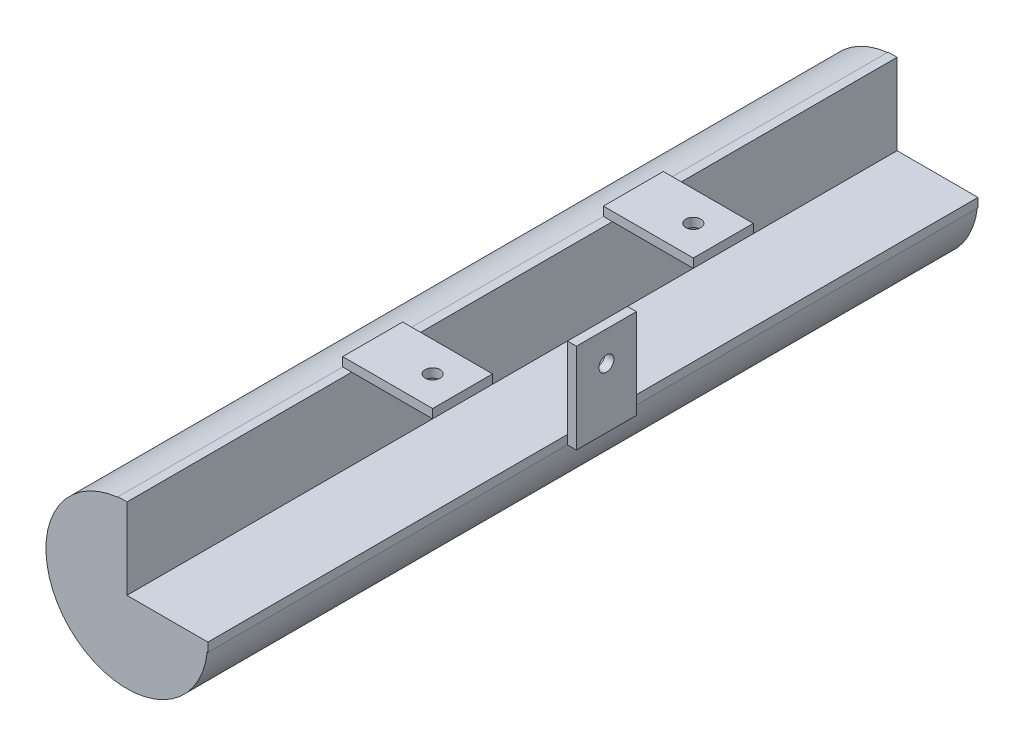
ISO-10303-21;
HEADER;
FILE_DESCRIPTION(('STEP AP214'),'2;1');
FILE_NAME('part.step','',(''),(''),'','','');
FILE_SCHEMA(('AUTOMOTIVE_DESIGN { 1 0 10303 214 1 1 1 1 }'));
ENDSEC;
DATA;
#1=APPLICATION_CONTEXT('core data for automotive mechanical design processes');
#2=APPLICATION_PROTOCOL_DEFINITION('international standard','automotive_design',2000,#1);
#3=PRODUCT_CONTEXT('',#1,'mechanical');
#4=PRODUCT('Part','Part','',(#3));
#5=PRODUCT_RELATED_PRODUCT_CATEGORY('part','',(#4));
#6=PRODUCT_DEFINITION_FORMATION('','',#4);
#7=PRODUCT_DEFINITION_CONTEXT('part definition',#1,'design');
#8=PRODUCT_DEFINITION('design','',#6,#7);
#9=PRODUCT_DEFINITION_SHAPE('','',#8);
#10=(LENGTH_UNIT() NAMED_UNIT(*) SI_UNIT(.MILLI.,.METRE.));
#11=(NAMED_UNIT(*) PLANE_ANGLE_UNIT() SI_UNIT($,.RADIAN.));
#12=(NAMED_UNIT(*) SI_UNIT($,.STERADIAN.) SOLID_ANGLE_UNIT());
#13=UNCERTAINTY_MEASURE_WITH_UNIT(LENGTH_MEASURE(1.E-05),#10,'distance_accuracy_value','');
#14=(GEOMETRIC_REPRESENTATION_CONTEXT(3) GLOBAL_UNCERTAINTY_ASSIGNED_CONTEXT((#13)) GLOBAL_UNIT_ASSIGNED_CONTEXT((#10,
#11,#12)) REPRESENTATION_CONTEXT('',''));
#15=CARTESIAN_POINT('',(0.,0.,0.));
#16=DIRECTION('',(0.,0.,1.));
#17=DIRECTION('',(1.,0.,0.));
#18=AXIS2_PLACEMENT_3D('',#15,#16,#17);
#19=CARTESIAN_POINT('',(27.,0.,128.5));
#20=DIRECTION('',(-1.,0.,0.));
#21=DIRECTION('',(0.,0.,1.));
#22=AXIS2_PLACEMENT_3D('',#19,#20,#21);
#23=PLANE('',#22);
#24=DIRECTION('',(0.,1.,0.));
#25=VECTOR('',#24,1.);
#26=CARTESIAN_POINT('',(27.,-3.,-11.5));
#27=LINE('',#26,#25);
#28=CARTESIAN_POINT('',(27.,-3.,-11.5));
#29=VERTEX_POINT('',#28);
#30=CARTESIAN_POINT('',(27.,0.,-11.5));
#31=VERTEX_POINT('',#30);
#32=EDGE_CURVE('E64',#29,#31,#27,.T.);
#33=ORIENTED_EDGE('',*,*,#32,.F.);
#34=DIRECTION('',(0.,0.,-1.));
#35=VECTOR('',#34,1.);
#36=CARTESIAN_POINT('',(27.,-3.,128.5));
#37=LINE('',#36,#35);
#38=CARTESIAN_POINT('',(27.,-3.,-128.5));
#39=VERTEX_POINT('',#38);
#40=EDGE_CURVE('E385',#29,#39,#37,.T.);
#41=ORIENTED_EDGE('',*,*,#40,.T.);
#42=DIRECTION('',(0.,1.,0.));
#43=VECTOR('',#42,1.);
#44=CARTESIAN_POINT('',(27.,0.,-128.5));
#45=LINE('',#44,#43);
#46=CARTESIAN_POINT('',(27.,0.,-128.5));
#47=VERTEX_POINT('',#46);
#48=EDGE_CURVE('E373',#39,#47,#45,.T.);
#49=ORIENTED_EDGE('',*,*,#48,.T.);
#50=DIRECTION('',(0.,0.,-1.));
#51=VECTOR('',#50,1.);
#52=CARTESIAN_POINT('',(27.,0.,128.5));
#53=LINE('',#52,#51);
#54=EDGE_CURVE('E69',#31,#47,#53,.T.);
#55=ORIENTED_EDGE('',*,*,#54,.F.);
#56=EDGE_LOOP('',(#33,#41,#49,#55));
#57=FACE_BOUND('',#56,.T.);
#58=ADVANCED_FACE('F45',(#57),#23,.F.);
#59=DIRECTION('',(0.,-1.,0.));
#60=VECTOR('',#59,1.);
#61=CARTESIAN_POINT('',(27.,-3.,8.50000000000001));
#62=LINE('',#61,#60);
#63=CARTESIAN_POINT('',(27.,0.,8.50000000000001));
#64=VERTEX_POINT('',#63);
#65=CARTESIAN_POINT('',(27.,-3.,8.50000000000001));
#66=VERTEX_POINT('',#65);
#67=EDGE_CURVE('E11',#64,#66,#62,.T.);
#68=ORIENTED_EDGE('',*,*,#67,.F.);
#69=CARTESIAN_POINT('',(27.,0.,128.5));
#70=VERTEX_POINT('',#69);
#71=EDGE_CURVE('E381',#70,#64,#53,.T.);
#72=ORIENTED_EDGE('',*,*,#71,.F.);
#73=DIRECTION('',(0.,1.,0.));
#74=VECTOR('',#73,1.);
#75=CARTESIAN_POINT('',(27.,0.,128.5));
#76=LINE('',#75,#74);
#77=CARTESIAN_POINT('',(27.,-3.,128.5));
#78=VERTEX_POINT('',#77);
#79=EDGE_CURVE('E349',#78,#70,#76,.T.);
#80=ORIENTED_EDGE('',*,*,#79,.F.);
#81=EDGE_CURVE('E387',#78,#66,#37,.T.);
#82=ORIENTED_EDGE('',*,*,#81,.T.);
#83=EDGE_LOOP('',(#68,#72,#80,#82));
#84=FACE_BOUND('',#83,.T.);
#85=ADVANCED_FACE('F529',(#84),#23,.F.);
#86=CARTESIAN_POINT('',(0.,27.,128.5));
#87=DIRECTION('',(0.,-1.,0.));
#88=DIRECTION('',(0.,0.,-1.));
#89=AXIS2_PLACEMENT_3D('',#86,#87,#88);
#90=PLANE('',#89);
#91=DIRECTION('',(1.,0.,0.));
#92=VECTOR('',#91,1.);
#93=CARTESIAN_POINT('',(-3.,27.,-33.5));
#94=LINE('',#93,#92);
#95=CARTESIAN_POINT('',(-3.,27.,-33.5));
#96=VERTEX_POINT('',#95);
#97=CARTESIAN_POINT('',(0.,27.,-33.5));
#98=VERTEX_POINT('',#97);
#99=EDGE_CURVE('E270',#96,#98,#94,.T.);
#100=ORIENTED_EDGE('',*,*,#99,.F.);
#101=DIRECTION('',(0.,0.,-1.));
#102=VECTOR('',#101,1.);
#103=CARTESIAN_POINT('',(-3.,27.,128.5));
#104=LINE('',#103,#102);
#105=CARTESIAN_POINT('',(-3.,27.,33.5));
#106=VERTEX_POINT('',#105);
#107=EDGE_CURVE('E402',#106,#96,#104,.T.);
#108=ORIENTED_EDGE('',*,*,#107,.F.);
#109=DIRECTION('',(-1.,0.,0.));
#110=VECTOR('',#109,1.);
#111=CARTESIAN_POINT('',(-3.,27.,33.5));
#112=LINE('',#111,#110);
#113=CARTESIAN_POINT('',(0.,27.,33.5));
#114=VERTEX_POINT('',#113);
#115=EDGE_CURVE('E55',#114,#106,#112,.T.);
#116=ORIENTED_EDGE('',*,*,#115,.F.);
#117=DIRECTION('',(0.,0.,-1.));
#118=VECTOR('',#117,1.);
#119=CARTESIAN_POINT('',(0.,27.,128.5));
#120=LINE('',#119,#118);
#121=EDGE_CURVE('E409',#114,#98,#120,.T.);
#122=ORIENTED_EDGE('',*,*,#121,.T.);
#123=EDGE_LOOP('',(#100,#108,#116,#122));
#124=FACE_BOUND('',#123,.T.);
#125=ADVANCED_FACE('F474',(#124),#90,.F.);
#126=DIRECTION('',(-1.,0.,0.));
#127=VECTOR('',#126,1.);
#128=CARTESIAN_POINT('',(-3.,27.,-53.5));
#129=LINE('',#128,#127);
#130=CARTESIAN_POINT('',(0.,27.,-53.5));
#131=VERTEX_POINT('',#130);
#132=CARTESIAN_POINT('',(-3.,27.,-53.5));
#133=VERTEX_POINT('',#132);
#134=EDGE_CURVE('E266',#131,#133,#129,.T.);
#135=ORIENTED_EDGE('',*,*,#134,.F.);
#136=CARTESIAN_POINT('',(0.,27.,-128.5));
#137=VERTEX_POINT('',#136);
#138=EDGE_CURVE('E401',#131,#137,#120,.T.);
#139=ORIENTED_EDGE('',*,*,#138,.T.);
#140=DIRECTION('',(-1.,0.,0.));
#141=VECTOR('',#140,1.);
#142=CARTESIAN_POINT('',(0.,27.,-128.5));
#143=LINE('',#142,#141);
#144=CARTESIAN_POINT('',(-3.,27.,-128.5));
#145=VERTEX_POINT('',#144);
#146=EDGE_CURVE('E359',#137,#145,#143,.T.);
#147=ORIENTED_EDGE('',*,*,#146,.T.);
#148=EDGE_CURVE('E397',#133,#145,#104,.T.);
#149=ORIENTED_EDGE('',*,*,#148,.F.);
#150=EDGE_LOOP('',(#135,#139,#147,#149));
#151=FACE_BOUND('',#150,.T.);
#152=ADVANCED_FACE('F422',(#151),#90,.F.);
#153=DIRECTION('',(1.,0.,0.));
#154=VECTOR('',#153,1.);
#155=CARTESIAN_POINT('',(-3.,27.,53.5));
#156=LINE('',#155,#154);
#157=CARTESIAN_POINT('',(-3.,27.,53.5));
#158=VERTEX_POINT('',#157);
#159=CARTESIAN_POINT('',(0.,27.,53.5));
#160=VERTEX_POINT('',#159);
#161=EDGE_CURVE('E306',#158,#160,#156,.T.);
#162=ORIENTED_EDGE('',*,*,#161,.F.);
#163=CARTESIAN_POINT('',(-3.,27.,128.5));
#164=VERTEX_POINT('',#163);
#165=EDGE_CURVE('E398',#164,#158,#104,.T.);
#166=ORIENTED_EDGE('',*,*,#165,.F.);
#167=DIRECTION('',(-1.,0.,0.));
#168=VECTOR('',#167,1.);
#169=CARTESIAN_POINT('',(0.,27.,128.5));
#170=LINE('',#169,#168);
#171=CARTESIAN_POINT('',(0.,27.,128.5));
#172=VERTEX_POINT('',#171);
#173=EDGE_CURVE('E336',#172,#164,#170,.T.);
#174=ORIENTED_EDGE('',*,*,#173,.F.);
#175=EDGE_CURVE('E49',#172,#160,#120,.T.);
#176=ORIENTED_EDGE('',*,*,#175,.T.);
#177=EDGE_LOOP('',(#162,#166,#174,#176));
#178=FACE_BOUND('',#177,.T.);
#179=ADVANCED_FACE('F446',(#178),#90,.F.);
#180=CARTESIAN_POINT('',(0.,27.,128.5));
#181=DIRECTION('',(-1.,0.,0.));
#182=DIRECTION('',(0.,-1.,0.));
#183=AXIS2_PLACEMENT_3D('',#180,#181,#182);
#184=PLANE('',#183);
#185=DIRECTION('',(0.,1.,0.));
#186=VECTOR('',#185,1.);
#187=CARTESIAN_POINT('',(0.,27.,-128.5));
#188=LINE('',#187,#186);
#189=CARTESIAN_POINT('',(0.,0.,-128.5));
#190=VERTEX_POINT('',#189);
#191=EDGE_CURVE('E331',#190,#137,#188,.T.);
#192=ORIENTED_EDGE('',*,*,#191,.T.);
#193=ORIENTED_EDGE('',*,*,#138,.F.);
#194=DIRECTION('',(0.,0.,1.));
#195=VECTOR('',#194,1.);
#196=CARTESIAN_POINT('',(0.,27.,128.5));
#197=LINE('',#196,#195);
#198=EDGE_CURVE('E274',#131,#98,#197,.T.);
#199=ORIENTED_EDGE('',*,*,#198,.T.);
#200=ORIENTED_EDGE('',*,*,#121,.F.);
#201=EDGE_CURVE('E468',#160,#114,#120,.T.);
#202=ORIENTED_EDGE('',*,*,#201,.F.);
#203=ORIENTED_EDGE('',*,*,#175,.F.);
#204=DIRECTION('',(0.,1.,0.));
#205=VECTOR('',#204,1.);
#206=CARTESIAN_POINT('',(0.,27.,128.5));
#207=LINE('',#206,#205);
#208=CARTESIAN_POINT('',(0.,0.,128.5));
#209=VERTEX_POINT('',#208);
#210=EDGE_CURVE('E332',#209,#172,#207,.T.);
#211=ORIENTED_EDGE('',*,*,#210,.F.);
#212=DIRECTION('',(0.,0.,-1.));
#213=VECTOR('',#212,1.);
#214=CARTESIAN_POINT('',(0.,0.,128.5));
#215=LINE('',#214,#213);
#216=EDGE_CURVE('E355',#209,#190,#215,.T.);
#217=ORIENTED_EDGE('',*,*,#216,.T.);
#218=EDGE_LOOP('',(#192,#193,#199,#200,#202,#203,#211,#217));
#219=FACE_BOUND('',#218,.T.);
#220=ADVANCED_FACE('F47',(#219),#184,.F.);
#221=CARTESIAN_POINT('',(-3.,27.,128.5));
#222=DIRECTION('',(1.,0.,0.));
#223=DIRECTION('',(0.,0.,-1.));
#224=AXIS2_PLACEMENT_3D('',#221,#222,#223);
#225=PLANE('',#224);
#226=DIRECTION('',(0.,-1.,0.));
#227=VECTOR('',#226,1.);
#228=CARTESIAN_POINT('',(-3.,27.,-128.5));
#229=LINE('',#228,#227);
#230=CARTESIAN_POINT('',(-3.,26.8328157299975,-128.5));
#231=VERTEX_POINT('',#230);
#232=EDGE_CURVE('E363',#145,#231,#229,.T.);
#233=ORIENTED_EDGE('',*,*,#232,.T.);
#234=DIRECTION('',(0.,0.,-1.));
#235=VECTOR('',#234,1.);
#236=CARTESIAN_POINT('',(-3.,26.8328157299975,128.5));
#237=LINE('',#236,#235);
#238=CARTESIAN_POINT('',(-3.,26.8328157299975,128.5));
#239=VERTEX_POINT('',#238);
#240=EDGE_CURVE('E394',#239,#231,#237,.T.);
#241=ORIENTED_EDGE('',*,*,#240,.F.);
#242=DIRECTION('',(0.,-1.,0.));
#243=VECTOR('',#242,1.);
#244=CARTESIAN_POINT('',(-3.,27.,128.5));
#245=LINE('',#244,#243);
#246=EDGE_CURVE('E340',#164,#239,#245,.T.);
#247=ORIENTED_EDGE('',*,*,#246,.F.);
#248=ORIENTED_EDGE('',*,*,#165,.T.);
#249=DIRECTION('',(0.,-1.,0.));
#250=VECTOR('',#249,1.);
#251=CARTESIAN_POINT('',(-3.,30.,53.5));
#252=LINE('',#251,#250);
#253=CARTESIAN_POINT('',(-3.,30.,53.5));
#254=VERTEX_POINT('',#253);
#255=EDGE_CURVE('E327',#254,#158,#252,.T.);
#256=ORIENTED_EDGE('',*,*,#255,.F.);
#257=DIRECTION('',(0.,0.,1.));
#258=VECTOR('',#257,1.);
#259=CARTESIAN_POINT('',(-3.,30.,53.5));
#260=LINE('',#259,#258);
#261=CARTESIAN_POINT('',(-3.,30.,33.5));
#262=VERTEX_POINT('',#261);
#263=EDGE_CURVE('E291',#262,#254,#260,.T.);
#264=ORIENTED_EDGE('',*,*,#263,.F.);
#265=DIRECTION('',(0.,-1.,0.));
#266=VECTOR('',#265,1.);
#267=CARTESIAN_POINT('',(-3.,30.,33.5));
#268=LINE('',#267,#266);
#269=EDGE_CURVE('E305',#262,#106,#268,.T.);
#270=ORIENTED_EDGE('',*,*,#269,.T.);
#271=ORIENTED_EDGE('',*,*,#107,.T.);
#272=DIRECTION('',(0.,-1.,0.));
#273=VECTOR('',#272,1.);
#274=CARTESIAN_POINT('',(-3.,30.,-33.5));
#275=LINE('',#274,#273);
#276=CARTESIAN_POINT('',(-3.,30.,-33.5));
#277=VERTEX_POINT('',#276);
#278=EDGE_CURVE('E239',#277,#96,#275,.T.);
#279=ORIENTED_EDGE('',*,*,#278,.F.);
#280=DIRECTION('',(0.,0.,1.));
#281=VECTOR('',#280,1.);
#282=CARTESIAN_POINT('',(-3.,30.,-33.5));
#283=LINE('',#282,#281);
#284=CARTESIAN_POINT('',(-3.,30.,-53.5));
#285=VERTEX_POINT('',#284);
#286=EDGE_CURVE('E283',#285,#277,#283,.T.);
#287=ORIENTED_EDGE('',*,*,#286,.F.);
#288=DIRECTION('',(0.,-1.,0.));
#289=VECTOR('',#288,1.);
#290=CARTESIAN_POINT('',(-3.,30.,-53.5));
#291=LINE('',#290,#289);
#292=EDGE_CURVE('E257',#285,#133,#291,.T.);
#293=ORIENTED_EDGE('',*,*,#292,.T.);
#294=ORIENTED_EDGE('',*,*,#148,.T.);
#295=EDGE_LOOP('',(#233,#241,#247,#248,#256,#264,#270,#271,#279,#287,#293,#294));
#296=FACE_BOUND('',#295,.T.);
#297=ADVANCED_FACE('F413',(#296),#225,.F.);
#298=CARTESIAN_POINT('',(-0.0331449920469178,-0.00368499870751979,128.5));
#299=DIRECTION('',(0.,0.,-1.));
#300=DIRECTION('',(-1.,0.,0.));
#301=AXIS2_PLACEMENT_3D('',#298,#299,#300);
#302=CYLINDRICAL_SURFACE('',#301,27.);
#303=CARTESIAN_POINT('',(-0.0331449920469178,-0.00368499870751979,-128.5));
#304=DIRECTION('',(0.,0.,1.));
#305=DIRECTION('',(1.,0.,0.));
#306=AXIS2_PLACEMENT_3D('',#303,#304,#305);
#307=CIRCLE('',#306,27.);
#308=CARTESIAN_POINT('',(26.8000824771382,-3.,-128.5));
#309=VERTEX_POINT('',#308);
#310=EDGE_CURVE('E366',#231,#309,#307,.T.);
#311=ORIENTED_EDGE('',*,*,#310,.T.);
#312=DIRECTION('',(0.,0.,-1.));
#313=VECTOR('',#312,1.);
#314=CARTESIAN_POINT('',(26.8000824771382,-3.,128.5));
#315=LINE('',#314,#313);
#316=CARTESIAN_POINT('',(26.8000824771382,-3.,128.5));
#317=VERTEX_POINT('',#316);
#318=EDGE_CURVE('E390',#317,#309,#315,.T.);
#319=ORIENTED_EDGE('',*,*,#318,.F.);
#320=CARTESIAN_POINT('',(-0.0331449920469178,-0.00368499870751979,128.5));
#321=DIRECTION('',(0.,0.,1.));
#322=DIRECTION('',(1.,0.,0.));
#323=AXIS2_PLACEMENT_3D('',#320,#321,#322);
#324=CIRCLE('',#323,27.);
#325=EDGE_CURVE('E343',#239,#317,#324,.T.);
#326=ORIENTED_EDGE('',*,*,#325,.F.);
#327=ORIENTED_EDGE('',*,*,#240,.T.);
#328=EDGE_LOOP('',(#311,#319,#326,#327));
#329=FACE_BOUND('',#328,.T.);
#330=ADVANCED_FACE('F432',(#329),#302,.T.);
#331=CARTESIAN_POINT('',(27.,-3.,128.5));
#332=DIRECTION('',(0.,1.,0.));
#333=DIRECTION('',(0.,0.,1.));
#334=AXIS2_PLACEMENT_3D('',#331,#332,#333);
#335=PLANE('',#334);
#336=DIRECTION('',(1.,0.,0.));
#337=VECTOR('',#336,1.);
#338=CARTESIAN_POINT('',(27.,-3.,-128.5));
#339=LINE('',#338,#337);
#340=EDGE_CURVE('E369',#309,#39,#339,.T.);
#341=ORIENTED_EDGE('',*,*,#340,.T.);
#342=ORIENTED_EDGE('',*,*,#40,.F.);
#343=DIRECTION('',(-1.,0.,0.));
#344=VECTOR('',#343,1.);
#345=CARTESIAN_POINT('',(30.,-3.,-11.5));
#346=LINE('',#345,#344);
#347=CARTESIAN_POINT('',(30.,-3.,-11.5));
#348=VERTEX_POINT('',#347);
#349=EDGE_CURVE('E491',#348,#29,#346,.T.);
#350=ORIENTED_EDGE('',*,*,#349,.F.);
#351=DIRECTION('',(0.,0.,-1.));
#352=VECTOR('',#351,1.);
#353=CARTESIAN_POINT('',(30.,-3.,-11.5));
#354=LINE('',#353,#352);
#355=CARTESIAN_POINT('',(30.,-3.,8.50000000000001));
#356=VERTEX_POINT('',#355);
#357=EDGE_CURVE('E213',#356,#348,#354,.T.);
#358=ORIENTED_EDGE('',*,*,#357,.F.);
#359=DIRECTION('',(-1.,0.,0.));
#360=VECTOR('',#359,1.);
#361=CARTESIAN_POINT('',(30.,-3.,8.50000000000001));
#362=LINE('',#361,#360);
#363=EDGE_CURVE('E231',#356,#66,#362,.T.);
#364=ORIENTED_EDGE('',*,*,#363,.T.);
#365=ORIENTED_EDGE('',*,*,#81,.F.);
#366=DIRECTION('',(1.,0.,0.));
#367=VECTOR('',#366,1.);
#368=CARTESIAN_POINT('',(27.,-3.,128.5));
#369=LINE('',#368,#367);
#370=EDGE_CURVE('E346',#317,#78,#369,.T.);
#371=ORIENTED_EDGE('',*,*,#370,.F.);
#372=ORIENTED_EDGE('',*,*,#318,.T.);
#373=EDGE_LOOP('',(#341,#342,#350,#358,#364,#365,#371,#372));
#374=FACE_BOUND('',#373,.T.);
#375=ADVANCED_FACE('F436',(#374),#335,.F.);
#376=CARTESIAN_POINT('',(0.,0.,128.5));
#377=DIRECTION('',(0.,-1.,0.));
#378=DIRECTION('',(0.,0.,-1.));
#379=AXIS2_PLACEMENT_3D('',#376,#377,#378);
#380=PLANE('',#379);
#381=DIRECTION('',(-1.,0.,0.));
#382=VECTOR('',#381,1.);
#383=CARTESIAN_POINT('',(0.,0.,-128.5));
#384=LINE('',#383,#382);
#385=EDGE_CURVE('E337',#47,#190,#384,.T.);
#386=ORIENTED_EDGE('',*,*,#385,.T.);
#387=ORIENTED_EDGE('',*,*,#216,.F.);
#388=DIRECTION('',(-1.,0.,0.));
#389=VECTOR('',#388,1.);
#390=CARTESIAN_POINT('',(0.,0.,128.5));
#391=LINE('',#390,#389);
#392=EDGE_CURVE('E352',#70,#209,#391,.T.);
#393=ORIENTED_EDGE('',*,*,#392,.F.);
#394=ORIENTED_EDGE('',*,*,#71,.T.);
#395=EDGE_CURVE('E386',#64,#31,#53,.T.);
#396=ORIENTED_EDGE('',*,*,#395,.T.);
#397=ORIENTED_EDGE('',*,*,#54,.T.);
#398=EDGE_LOOP('',(#386,#387,#393,#394,#396,#397));
#399=FACE_BOUND('',#398,.T.);
#400=ADVANCED_FACE('F531',(#399),#380,.F.);
#401=CARTESIAN_POINT('',(-0.0331449920469178,-0.00368499870751979,128.5));
#402=DIRECTION('',(0.,0.,1.));
#403=DIRECTION('',(1.,0.,0.));
#404=AXIS2_PLACEMENT_3D('',#401,#402,#403);
#405=PLANE('',#404);
#406=ORIENTED_EDGE('',*,*,#210,.T.);
#407=ORIENTED_EDGE('',*,*,#173,.T.);
#408=ORIENTED_EDGE('',*,*,#246,.T.);
#409=ORIENTED_EDGE('',*,*,#325,.T.);
#410=ORIENTED_EDGE('',*,*,#370,.T.);
#411=ORIENTED_EDGE('',*,*,#79,.T.);
#412=ORIENTED_EDGE('',*,*,#392,.T.);
#413=EDGE_LOOP('',(#406,#407,#408,#409,#410,#411,#412));
#414=FACE_BOUND('',#413,.T.);
#415=ADVANCED_FACE('F441',(#414),#405,.T.);
#416=CARTESIAN_POINT('',(-0.0331449920469178,-0.00368499870751979,-128.5));
#417=DIRECTION('',(0.,0.,1.));
#418=DIRECTION('',(1.,0.,0.));
#419=AXIS2_PLACEMENT_3D('',#416,#417,#418);
#420=PLANE('',#419);
#421=ORIENTED_EDGE('',*,*,#191,.F.);
#422=ORIENTED_EDGE('',*,*,#385,.F.);
#423=ORIENTED_EDGE('',*,*,#48,.F.);
#424=ORIENTED_EDGE('',*,*,#340,.F.);
#425=ORIENTED_EDGE('',*,*,#310,.F.);
#426=ORIENTED_EDGE('',*,*,#232,.F.);
#427=ORIENTED_EDGE('',*,*,#146,.F.);
#428=EDGE_LOOP('',(#421,#422,#423,#424,#425,#426,#427));
#429=FACE_BOUND('',#428,.T.);
#430=ADVANCED_FACE('F427',(#429),#420,.F.);
#431=CARTESIAN_POINT('',(-3.,30.,53.5));
#432=DIRECTION('',(0.,0.,-1.));
#433=DIRECTION('',(-1.,0.,0.));
#434=AXIS2_PLACEMENT_3D('',#431,#432,#433);
#435=PLANE('',#434);
#436=ORIENTED_EDGE('',*,*,#161,.T.);
#437=CARTESIAN_POINT('',(27.,27.,53.5));
#438=VERTEX_POINT('',#437);
#439=EDGE_CURVE('E290',#160,#438,#156,.T.);
#440=ORIENTED_EDGE('',*,*,#439,.T.);
#441=DIRECTION('',(0.,-1.,0.));
#442=VECTOR('',#441,1.);
#443=CARTESIAN_POINT('',(27.,30.,53.5));
#444=LINE('',#443,#442);
#445=CARTESIAN_POINT('',(27.,30.,53.5));
#446=VERTEX_POINT('',#445);
#447=EDGE_CURVE('E323',#446,#438,#444,.T.);
#448=ORIENTED_EDGE('',*,*,#447,.F.);
#449=DIRECTION('',(1.,0.,0.));
#450=VECTOR('',#449,1.);
#451=CARTESIAN_POINT('',(-3.,30.,53.5));
#452=LINE('',#451,#450);
#453=EDGE_CURVE('E295',#254,#446,#452,.T.);
#454=ORIENTED_EDGE('',*,*,#453,.F.);
#455=ORIENTED_EDGE('',*,*,#255,.T.);
#456=EDGE_LOOP('',(#436,#440,#448,#454,#455));
#457=FACE_BOUND('',#456,.T.);
#458=ADVANCED_FACE('F449',(#457),#435,.F.);
#459=CARTESIAN_POINT('',(27.,30.,53.5));
#460=DIRECTION('',(-1.,0.,0.));
#461=DIRECTION('',(0.,0.,1.));
#462=AXIS2_PLACEMENT_3D('',#459,#460,#461);
#463=PLANE('',#462);
#464=DIRECTION('',(0.,0.,-1.));
#465=VECTOR('',#464,1.);
#466=CARTESIAN_POINT('',(27.,27.,53.5));
#467=LINE('',#466,#465);
#468=CARTESIAN_POINT('',(27.,27.,33.5));
#469=VERTEX_POINT('',#468);
#470=EDGE_CURVE('E310',#438,#469,#467,.T.);
#471=ORIENTED_EDGE('',*,*,#470,.T.);
#472=DIRECTION('',(0.,-1.,0.));
#473=VECTOR('',#472,1.);
#474=CARTESIAN_POINT('',(27.,30.,33.5));
#475=LINE('',#474,#473);
#476=CARTESIAN_POINT('',(27.,30.,33.5));
#477=VERTEX_POINT('',#476);
#478=EDGE_CURVE('E319',#477,#469,#475,.T.);
#479=ORIENTED_EDGE('',*,*,#478,.F.);
#480=DIRECTION('',(0.,0.,-1.));
#481=VECTOR('',#480,1.);
#482=CARTESIAN_POINT('',(27.,30.,53.5));
#483=LINE('',#482,#481);
#484=EDGE_CURVE('E299',#446,#477,#483,.T.);
#485=ORIENTED_EDGE('',*,*,#484,.F.);
#486=ORIENTED_EDGE('',*,*,#447,.T.);
#487=EDGE_LOOP('',(#471,#479,#485,#486));
#488=FACE_BOUND('',#487,.T.);
#489=ADVANCED_FACE('F602',(#488),#463,.F.);
#490=CARTESIAN_POINT('',(-3.,30.,33.5));
#491=DIRECTION('',(0.,0.,1.));
#492=DIRECTION('',(1.,0.,0.));
#493=AXIS2_PLACEMENT_3D('',#490,#491,#492);
#494=PLANE('',#493);
#495=EDGE_CURVE('E296',#469,#114,#112,.T.);
#496=ORIENTED_EDGE('',*,*,#495,.T.);
#497=ORIENTED_EDGE('',*,*,#115,.T.);
#498=ORIENTED_EDGE('',*,*,#269,.F.);
#499=DIRECTION('',(-1.,0.,0.));
#500=VECTOR('',#499,1.);
#501=CARTESIAN_POINT('',(-3.,30.,33.5));
#502=LINE('',#501,#500);
#503=EDGE_CURVE('E302',#477,#262,#502,.T.);
#504=ORIENTED_EDGE('',*,*,#503,.F.);
#505=ORIENTED_EDGE('',*,*,#478,.T.);
#506=EDGE_LOOP('',(#496,#497,#498,#504,#505));
#507=FACE_BOUND('',#506,.T.);
#508=ADVANCED_FACE('F461',(#507),#494,.F.);
#509=CARTESIAN_POINT('',(0.,30.,0.));
#510=DIRECTION('',(0.,-1.,0.));
#511=DIRECTION('',(0.,0.,-1.));
#512=AXIS2_PLACEMENT_3D('',#509,#510,#511);
#513=PLANE('',#512);
#514=CARTESIAN_POINT('',(17.,30.,43.5));
#515=DIRECTION('',(0.,1.,0.));
#516=DIRECTION('',(0.,0.,1.));
#517=AXIS2_PLACEMENT_3D('',#514,#515,#516);
#518=CIRCLE('',#517,2.5);
#519=CARTESIAN_POINT('',(17.,30.,46.));
#520=VERTEX_POINT('',#519);
#521=EDGE_CURVE('E240',#520,#520,#518,.T.);
#522=ORIENTED_EDGE('',*,*,#521,.F.);
#523=EDGE_LOOP('',(#522));
#524=FACE_BOUND('',#523,.T.);
#525=ORIENTED_EDGE('',*,*,#263,.T.);
#526=ORIENTED_EDGE('',*,*,#453,.T.);
#527=ORIENTED_EDGE('',*,*,#484,.T.);
#528=ORIENTED_EDGE('',*,*,#503,.T.);
#529=EDGE_LOOP('',(#525,#526,#527,#528));
#530=FACE_BOUND('',#529,.T.);
#531=ADVANCED_FACE('F455',(#524,#530),#513,.F.);
#532=CARTESIAN_POINT('',(0.,27.,0.));
#533=DIRECTION('',(0.,-1.,0.));
#534=DIRECTION('',(0.,0.,-1.));
#535=AXIS2_PLACEMENT_3D('',#532,#533,#534);
#536=PLANE('',#535);
#537=CARTESIAN_POINT('',(17.,27.,43.5));
#538=DIRECTION('',(0.,-1.,0.));
#539=DIRECTION('',(0.,0.,-1.));
#540=AXIS2_PLACEMENT_3D('',#537,#538,#539);
#541=CIRCLE('',#540,2.5);
#542=CARTESIAN_POINT('',(17.,27.,41.));
#543=VERTEX_POINT('',#542);
#544=EDGE_CURVE('E235',#543,#543,#541,.F.);
#545=ORIENTED_EDGE('',*,*,#544,.T.);
#546=EDGE_LOOP('',(#545));
#547=FACE_BOUND('',#546,.T.);
#548=ORIENTED_EDGE('',*,*,#439,.F.);
#549=ORIENTED_EDGE('',*,*,#201,.T.);
#550=ORIENTED_EDGE('',*,*,#495,.F.);
#551=ORIENTED_EDGE('',*,*,#470,.F.);
#552=EDGE_LOOP('',(#548,#549,#550,#551));
#553=FACE_BOUND('',#552,.T.);
#554=ADVANCED_FACE('F629',(#547,#553),#536,.T.);
#555=CARTESIAN_POINT('',(0.,27.,0.));
#556=DIRECTION('',(0.,-1.,0.));
#557=DIRECTION('',(0.,0.,-1.));
#558=AXIS2_PLACEMENT_3D('',#555,#556,#557);
#559=PLANE('',#558);
#560=CARTESIAN_POINT('',(17.,27.,-43.5));
#561=DIRECTION('',(0.,-1.,0.));
#562=DIRECTION('',(0.,0.,-1.));
#563=AXIS2_PLACEMENT_3D('',#560,#561,#562);
#564=CIRCLE('',#563,2.5);
#565=CARTESIAN_POINT('',(17.,27.,-46.));
#566=VERTEX_POINT('',#565);
#567=EDGE_CURVE('E224',#566,#566,#564,.F.);
#568=ORIENTED_EDGE('',*,*,#567,.T.);
#569=EDGE_LOOP('',(#568));
#570=FACE_BOUND('',#569,.T.);
#571=ORIENTED_EDGE('',*,*,#198,.F.);
#572=CARTESIAN_POINT('',(27.,27.,-53.5));
#573=VERTEX_POINT('',#572);
#574=EDGE_CURVE('E261',#573,#131,#129,.T.);
#575=ORIENTED_EDGE('',*,*,#574,.F.);
#576=DIRECTION('',(0.,0.,-1.));
#577=VECTOR('',#576,1.);
#578=CARTESIAN_POINT('',(27.,27.,-33.5));
#579=LINE('',#578,#577);
#580=CARTESIAN_POINT('',(27.,27.,-33.5));
#581=VERTEX_POINT('',#580);
#582=EDGE_CURVE('E265',#581,#573,#579,.T.);
#583=ORIENTED_EDGE('',*,*,#582,.F.);
#584=EDGE_CURVE('E269',#98,#581,#94,.T.);
#585=ORIENTED_EDGE('',*,*,#584,.F.);
#586=EDGE_LOOP('',(#571,#575,#583,#585));
#587=FACE_BOUND('',#586,.T.);
#588=ADVANCED_FACE('F478',(#570,#587),#559,.T.);
#589=CARTESIAN_POINT('',(-3.,30.,-33.5));
#590=DIRECTION('',(0.,0.,-1.));
#591=DIRECTION('',(-1.,0.,0.));
#592=AXIS2_PLACEMENT_3D('',#589,#590,#591);
#593=PLANE('',#592);
#594=ORIENTED_EDGE('',*,*,#99,.T.);
#595=ORIENTED_EDGE('',*,*,#584,.T.);
#596=DIRECTION('',(0.,-1.,0.));
#597=VECTOR('',#596,1.);
#598=CARTESIAN_POINT('',(27.,30.,-33.5));
#599=LINE('',#598,#597);
#600=CARTESIAN_POINT('',(27.,30.,-33.5));
#601=VERTEX_POINT('',#600);
#602=EDGE_CURVE('E249',#601,#581,#599,.T.);
#603=ORIENTED_EDGE('',*,*,#602,.F.);
#604=DIRECTION('',(1.,0.,0.));
#605=VECTOR('',#604,1.);
#606=CARTESIAN_POINT('',(-3.,30.,-33.5));
#607=LINE('',#606,#605);
#608=EDGE_CURVE('E280',#277,#601,#607,.T.);
#609=ORIENTED_EDGE('',*,*,#608,.F.);
#610=ORIENTED_EDGE('',*,*,#278,.T.);
#611=EDGE_LOOP('',(#594,#595,#603,#609,#610));
#612=FACE_BOUND('',#611,.T.);
#613=ADVANCED_FACE('F649',(#612),#593,.F.);
#614=CARTESIAN_POINT('',(27.,30.,-33.5));
#615=DIRECTION('',(-1.,0.,0.));
#616=DIRECTION('',(0.,0.,1.));
#617=AXIS2_PLACEMENT_3D('',#614,#615,#616);
#618=PLANE('',#617);
#619=ORIENTED_EDGE('',*,*,#582,.T.);
#620=DIRECTION('',(0.,-1.,0.));
#621=VECTOR('',#620,1.);
#622=CARTESIAN_POINT('',(27.,30.,-53.5));
#623=LINE('',#622,#621);
#624=CARTESIAN_POINT('',(27.,30.,-53.5));
#625=VERTEX_POINT('',#624);
#626=EDGE_CURVE('E253',#625,#573,#623,.T.);
#627=ORIENTED_EDGE('',*,*,#626,.F.);
#628=DIRECTION('',(0.,0.,-1.));
#629=VECTOR('',#628,1.);
#630=CARTESIAN_POINT('',(27.,30.,-33.5));
#631=LINE('',#630,#629);
#632=EDGE_CURVE('E277',#601,#625,#631,.T.);
#633=ORIENTED_EDGE('',*,*,#632,.F.);
#634=ORIENTED_EDGE('',*,*,#602,.T.);
#635=EDGE_LOOP('',(#619,#627,#633,#634));
#636=FACE_BOUND('',#635,.T.);
#637=ADVANCED_FACE('F659',(#636),#618,.F.);
#638=CARTESIAN_POINT('',(-3.,30.,-53.5));
#639=DIRECTION('',(0.,0.,1.));
#640=DIRECTION('',(1.,0.,0.));
#641=AXIS2_PLACEMENT_3D('',#638,#639,#640);
#642=PLANE('',#641);
#643=ORIENTED_EDGE('',*,*,#574,.T.);
#644=ORIENTED_EDGE('',*,*,#134,.T.);
#645=ORIENTED_EDGE('',*,*,#292,.F.);
#646=DIRECTION('',(-1.,0.,0.));
#647=VECTOR('',#646,1.);
#648=CARTESIAN_POINT('',(-3.,30.,-53.5));
#649=LINE('',#648,#647);
#650=EDGE_CURVE('E260',#625,#285,#649,.T.);
#651=ORIENTED_EDGE('',*,*,#650,.F.);
#652=ORIENTED_EDGE('',*,*,#626,.T.);
#653=EDGE_LOOP('',(#643,#644,#645,#651,#652));
#654=FACE_BOUND('',#653,.T.);
#655=ADVANCED_FACE('F481',(#654),#642,.F.);
#656=CARTESIAN_POINT('',(0.,30.,0.));
#657=DIRECTION('',(0.,-1.,0.));
#658=DIRECTION('',(0.,0.,-1.));
#659=AXIS2_PLACEMENT_3D('',#656,#657,#658);
#660=PLANE('',#659);
#661=CARTESIAN_POINT('',(17.,30.,-43.5));
#662=DIRECTION('',(0.,1.,0.));
#663=DIRECTION('',(0.,0.,1.));
#664=AXIS2_PLACEMENT_3D('',#661,#662,#663);
#665=CIRCLE('',#664,2.5);
#666=CARTESIAN_POINT('',(17.,30.,-41.));
#667=VERTEX_POINT('',#666);
#668=EDGE_CURVE('E229',#667,#667,#665,.T.);
#669=ORIENTED_EDGE('',*,*,#668,.F.);
#670=EDGE_LOOP('',(#669));
#671=FACE_BOUND('',#670,.T.);
#672=ORIENTED_EDGE('',*,*,#286,.T.);
#673=ORIENTED_EDGE('',*,*,#608,.T.);
#674=ORIENTED_EDGE('',*,*,#632,.T.);
#675=ORIENTED_EDGE('',*,*,#650,.T.);
#676=EDGE_LOOP('',(#672,#673,#674,#675));
#677=FACE_BOUND('',#676,.T.);
#678=ADVANCED_FACE('F677',(#671,#677),#660,.F.);
#679=CARTESIAN_POINT('',(17.,-27.0046849987075,-43.5));
#680=DIRECTION('',(0.,1.,0.));
#681=DIRECTION('',(0.,0.,1.));
#682=AXIS2_PLACEMENT_3D('',#679,#680,#681);
#683=CYLINDRICAL_SURFACE('',#682,2.5);
#684=ORIENTED_EDGE('',*,*,#567,.F.);
#685=EDGE_LOOP('',(#684));
#686=FACE_BOUND('',#685,.T.);
#687=ORIENTED_EDGE('',*,*,#668,.T.);
#688=EDGE_LOOP('',(#687));
#689=FACE_BOUND('',#688,.T.);
#690=ADVANCED_FACE('F685',(#686,#689),#683,.F.);
#691=CARTESIAN_POINT('',(17.,-27.0046849987075,43.5));
#692=DIRECTION('',(0.,1.,0.));
#693=DIRECTION('',(0.,0.,1.));
#694=AXIS2_PLACEMENT_3D('',#691,#692,#693);
#695=CYLINDRICAL_SURFACE('',#694,2.5);
#696=ORIENTED_EDGE('',*,*,#544,.F.);
#697=EDGE_LOOP('',(#696));
#698=FACE_BOUND('',#697,.T.);
#699=ORIENTED_EDGE('',*,*,#521,.T.);
#700=EDGE_LOOP('',(#699));
#701=FACE_BOUND('',#700,.T.);
#702=ADVANCED_FACE('F695',(#698,#701),#695,.F.);
#703=CARTESIAN_POINT('',(30.,-3.,-11.5));
#704=DIRECTION('',(0.,0.,1.));
#705=DIRECTION('',(1.,0.,0.));
#706=AXIS2_PLACEMENT_3D('',#703,#704,#705);
#707=PLANE('',#706);
#708=ORIENTED_EDGE('',*,*,#32,.T.);
#709=CARTESIAN_POINT('',(27.,27.,-11.5));
#710=VERTEX_POINT('',#709);
#711=EDGE_CURVE('E221',#31,#710,#27,.T.);
#712=ORIENTED_EDGE('',*,*,#711,.T.);
#713=DIRECTION('',(-1.,0.,0.));
#714=VECTOR('',#713,1.);
#715=CARTESIAN_POINT('',(30.,27.,-11.5));
#716=LINE('',#715,#714);
#717=CARTESIAN_POINT('',(30.,27.,-11.5));
#718=VERTEX_POINT('',#717);
#719=EDGE_CURVE('E201',#718,#710,#716,.T.);
#720=ORIENTED_EDGE('',*,*,#719,.F.);
#721=DIRECTION('',(0.,1.,0.));
#722=VECTOR('',#721,1.);
#723=CARTESIAN_POINT('',(30.,-3.,-11.5));
#724=LINE('',#723,#722);
#725=EDGE_CURVE('E208',#348,#718,#724,.T.);
#726=ORIENTED_EDGE('',*,*,#725,.F.);
#727=ORIENTED_EDGE('',*,*,#349,.T.);
#728=EDGE_LOOP('',(#708,#712,#720,#726,#727));
#729=FACE_BOUND('',#728,.T.);
#730=ADVANCED_FACE('F219',(#729),#707,.F.);
#731=CARTESIAN_POINT('',(30.,27.,-11.5));
#732=DIRECTION('',(0.,-1.,0.));
#733=DIRECTION('',(0.,0.,-1.));
#734=AXIS2_PLACEMENT_3D('',#731,#732,#733);
#735=PLANE('',#734);
#736=DIRECTION('',(0.,0.,1.));
#737=VECTOR('',#736,1.);
#738=CARTESIAN_POINT('',(27.,27.,-11.5));
#739=LINE('',#738,#737);
#740=CARTESIAN_POINT('',(27.,27.,8.50000000000001));
#741=VERTEX_POINT('',#740);
#742=EDGE_CURVE('E500',#710,#741,#739,.T.);
#743=ORIENTED_EDGE('',*,*,#742,.T.);
#744=DIRECTION('',(-1.,0.,0.));
#745=VECTOR('',#744,1.);
#746=CARTESIAN_POINT('',(30.,27.,8.50000000000001));
#747=LINE('',#746,#745);
#748=CARTESIAN_POINT('',(30.,27.,8.50000000000001));
#749=VERTEX_POINT('',#748);
#750=EDGE_CURVE('E203',#749,#741,#747,.T.);
#751=ORIENTED_EDGE('',*,*,#750,.F.);
#752=DIRECTION('',(0.,0.,1.));
#753=VECTOR('',#752,1.);
#754=CARTESIAN_POINT('',(30.,27.,-11.5));
#755=LINE('',#754,#753);
#756=EDGE_CURVE('E197',#718,#749,#755,.T.);
#757=ORIENTED_EDGE('',*,*,#756,.F.);
#758=ORIENTED_EDGE('',*,*,#719,.T.);
#759=EDGE_LOOP('',(#743,#751,#757,#758));
#760=FACE_BOUND('',#759,.T.);
#761=ADVANCED_FACE('F199',(#760),#735,.F.);
#762=CARTESIAN_POINT('',(30.,-3.,8.50000000000001));
#763=DIRECTION('',(0.,0.,-1.));
#764=DIRECTION('',(-1.,0.,0.));
#765=AXIS2_PLACEMENT_3D('',#762,#763,#764);
#766=PLANE('',#765);
#767=EDGE_CURVE('E57',#741,#64,#62,.T.);
#768=ORIENTED_EDGE('',*,*,#767,.T.);
#769=ORIENTED_EDGE('',*,*,#67,.T.);
#770=ORIENTED_EDGE('',*,*,#363,.F.);
#771=DIRECTION('',(0.,-1.,0.));
#772=VECTOR('',#771,1.);
#773=CARTESIAN_POINT('',(30.,-3.,8.50000000000001));
#774=LINE('',#773,#772);
#775=EDGE_CURVE('E207',#749,#356,#774,.T.);
#776=ORIENTED_EDGE('',*,*,#775,.F.);
#777=ORIENTED_EDGE('',*,*,#750,.T.);
#778=EDGE_LOOP('',(#768,#769,#770,#776,#777));
#779=FACE_BOUND('',#778,.T.);
#780=ADVANCED_FACE('F526',(#779),#766,.F.);
#781=CARTESIAN_POINT('',(30.,0.,0.));
#782=DIRECTION('',(1.,0.,0.));
#783=DIRECTION('',(0.,0.,-1.));
#784=AXIS2_PLACEMENT_3D('',#781,#782,#783);
#785=PLANE('',#784);
#786=CARTESIAN_POINT('',(30.,17.,-1.49999999999999));
#787=DIRECTION('',(1.,0.,0.));
#788=DIRECTION('',(0.,0.,-1.));
#789=AXIS2_PLACEMENT_3D('',#786,#787,#788);
#790=CIRCLE('',#789,2.5);
#791=CARTESIAN_POINT('',(30.,17.,-3.99999999999999));
#792=VERTEX_POINT('',#791);
#793=EDGE_CURVE('E507',#792,#792,#790,.T.);
#794=ORIENTED_EDGE('',*,*,#793,.F.);
#795=EDGE_LOOP('',(#794));
#796=FACE_BOUND('',#795,.T.);
#797=ORIENTED_EDGE('',*,*,#725,.T.);
#798=ORIENTED_EDGE('',*,*,#756,.T.);
#799=ORIENTED_EDGE('',*,*,#775,.T.);
#800=ORIENTED_EDGE('',*,*,#357,.T.);
#801=EDGE_LOOP('',(#797,#798,#799,#800));
#802=FACE_BOUND('',#801,.T.);
#803=ADVANCED_FACE('F211',(#796,#802),#785,.T.);
#804=CARTESIAN_POINT('',(27.,0.,0.));
#805=DIRECTION('',(1.,0.,0.));
#806=DIRECTION('',(0.,0.,-1.));
#807=AXIS2_PLACEMENT_3D('',#804,#805,#806);
#808=PLANE('',#807);
#809=CARTESIAN_POINT('',(27.,17.,-1.49999999999999));
#810=DIRECTION('',(1.,0.,0.));
#811=DIRECTION('',(0.,0.,-1.));
#812=AXIS2_PLACEMENT_3D('',#809,#810,#811);
#813=CIRCLE('',#812,2.5);
#814=CARTESIAN_POINT('',(27.,17.,-3.99999999999999));
#815=VERTEX_POINT('',#814);
#816=EDGE_CURVE('E511',#815,#815,#813,.F.);
#817=ORIENTED_EDGE('',*,*,#816,.F.);
#818=EDGE_LOOP('',(#817));
#819=FACE_BOUND('',#818,.T.);
#820=ORIENTED_EDGE('',*,*,#395,.F.);
#821=ORIENTED_EDGE('',*,*,#767,.F.);
#822=ORIENTED_EDGE('',*,*,#742,.F.);
#823=ORIENTED_EDGE('',*,*,#711,.F.);
#824=EDGE_LOOP('',(#820,#821,#822,#823));
#825=FACE_BOUND('',#824,.T.);
#826=ADVANCED_FACE('F518',(#819,#825),#808,.F.);
#827=CARTESIAN_POINT('',(-27.0341449920469,17.,-1.49999999999999));
#828=DIRECTION('',(1.,0.,0.));
#829=DIRECTION('',(0.,0.,-1.));
#830=AXIS2_PLACEMENT_3D('',#827,#828,#829);
#831=CYLINDRICAL_SURFACE('',#830,2.5);
#832=ORIENTED_EDGE('',*,*,#793,.T.);
#833=EDGE_LOOP('',(#832));
#834=FACE_BOUND('',#833,.T.);
#835=ORIENTED_EDGE('',*,*,#816,.T.);
#836=EDGE_LOOP('',(#835));
#837=FACE_BOUND('',#836,.T.);
#838=ADVANCED_FACE('F516',(#834,#837),#831,.F.);
#839=CLOSED_SHELL('',(#58,#85,#125,#152,#179,#220,#297,#330,#375,#400,#415,#430,#458,#489,#508,
#531,#554,#588,#613,#637,#655,#678,#690,#702,#730,#761,#780,#803,#826,#838));
#840=MANIFOLD_SOLID_BREP('B2',#839);
#841=ADVANCED_BREP_SHAPE_REPRESENTATION('',(#18,#840),#14);
#842=SHAPE_DEFINITION_REPRESENTATION(#9,#841);
ENDSEC;
END-ISO-10303-21;
